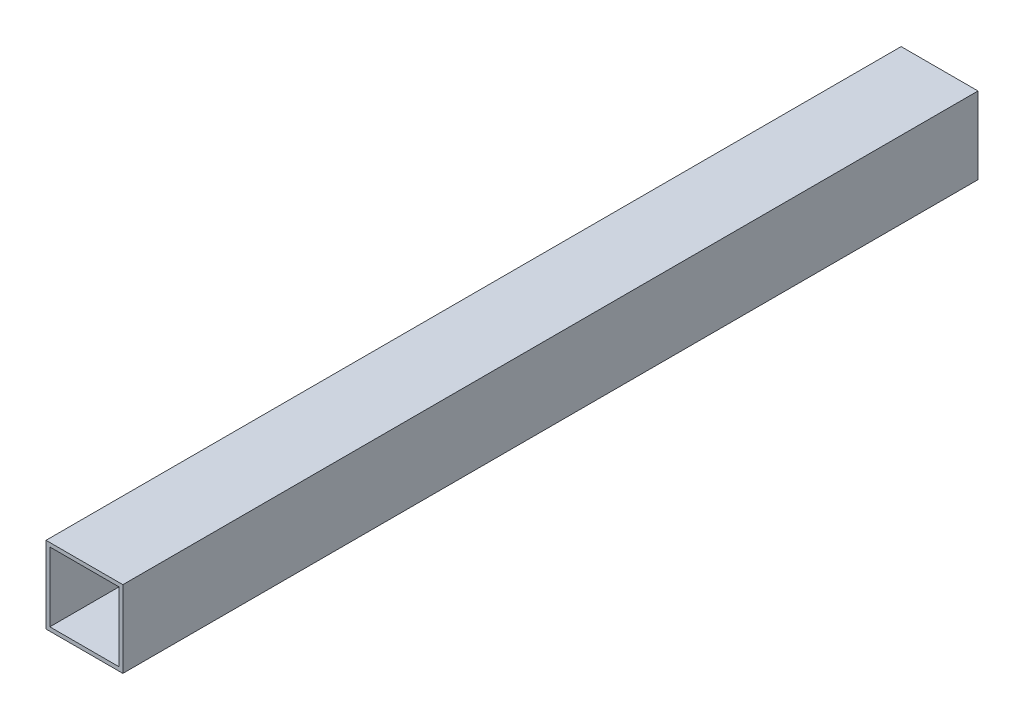
ISO-10303-21;
HEADER;
FILE_DESCRIPTION(('STEP AP214'),'2;1');
FILE_NAME('part.step','',(''),(''),'','','');
FILE_SCHEMA(('AUTOMOTIVE_DESIGN { 1 0 10303 214 1 1 1 1 }'));
ENDSEC;
DATA;
#1=APPLICATION_CONTEXT('core data for automotive mechanical design processes');
#2=APPLICATION_PROTOCOL_DEFINITION('international standard','automotive_design',2000,#1);
#3=PRODUCT_CONTEXT('',#1,'mechanical');
#4=PRODUCT('Part','Part','',(#3));
#5=PRODUCT_RELATED_PRODUCT_CATEGORY('part','',(#4));
#6=PRODUCT_DEFINITION_FORMATION('','',#4);
#7=PRODUCT_DEFINITION_CONTEXT('part definition',#1,'design');
#8=PRODUCT_DEFINITION('design','',#6,#7);
#9=PRODUCT_DEFINITION_SHAPE('','',#8);
#10=(LENGTH_UNIT() NAMED_UNIT(*) SI_UNIT(.MILLI.,.METRE.));
#11=(NAMED_UNIT(*) PLANE_ANGLE_UNIT() SI_UNIT($,.RADIAN.));
#12=(NAMED_UNIT(*) SI_UNIT($,.STERADIAN.) SOLID_ANGLE_UNIT());
#13=UNCERTAINTY_MEASURE_WITH_UNIT(LENGTH_MEASURE(1.E-05),#10,'distance_accuracy_value','');
#14=(GEOMETRIC_REPRESENTATION_CONTEXT(3) GLOBAL_UNCERTAINTY_ASSIGNED_CONTEXT((#13)) GLOBAL_UNIT_ASSIGNED_CONTEXT((#10,
#11,#12)) REPRESENTATION_CONTEXT('',''));
#15=CARTESIAN_POINT('',(0.,0.,0.));
#16=DIRECTION('',(0.,0.,1.));
#17=DIRECTION('',(1.,0.,0.));
#18=AXIS2_PLACEMENT_3D('',#15,#16,#17);
#19=CARTESIAN_POINT('',(-20.,-20.,445.));
#20=DIRECTION('',(0.,0.,1.));
#21=DIRECTION('',(1.,0.,0.));
#22=AXIS2_PLACEMENT_3D('',#19,#20,#21);
#23=PLANE('',#22);
#24=DIRECTION('',(0.,-1.,0.));
#25=VECTOR('',#24,1.);
#26=CARTESIAN_POINT('',(-20.,-20.,445.));
#27=LINE('',#26,#25);
#28=CARTESIAN_POINT('',(-20.,20.,445.));
#29=VERTEX_POINT('',#28);
#30=CARTESIAN_POINT('',(-20.,-20.,445.));
#31=VERTEX_POINT('',#30);
#32=EDGE_CURVE('E156',#29,#31,#27,.T.);
#33=ORIENTED_EDGE('',*,*,#32,.T.);
#34=DIRECTION('',(1.,0.,0.));
#35=VECTOR('',#34,1.);
#36=CARTESIAN_POINT('',(20.,-20.,445.));
#37=LINE('',#36,#35);
#38=CARTESIAN_POINT('',(20.,-20.,445.));
#39=VERTEX_POINT('',#38);
#40=EDGE_CURVE('E159',#31,#39,#37,.T.);
#41=ORIENTED_EDGE('',*,*,#40,.T.);
#42=DIRECTION('',(0.,1.,0.));
#43=VECTOR('',#42,1.);
#44=CARTESIAN_POINT('',(20.,-20.,445.));
#45=LINE('',#44,#43);
#46=CARTESIAN_POINT('',(20.,20.,445.));
#47=VERTEX_POINT('',#46);
#48=EDGE_CURVE('E162',#39,#47,#45,.T.);
#49=ORIENTED_EDGE('',*,*,#48,.T.);
#50=DIRECTION('',(-1.,0.,0.));
#51=VECTOR('',#50,1.);
#52=CARTESIAN_POINT('',(20.,20.,445.));
#53=LINE('',#52,#51);
#54=EDGE_CURVE('E164',#47,#29,#53,.T.);
#55=ORIENTED_EDGE('',*,*,#54,.T.);
#56=EDGE_LOOP('',(#33,#41,#49,#55));
#57=FACE_BOUND('',#56,.T.);
#58=DIRECTION('',(1.,0.,0.));
#59=VECTOR('',#58,1.);
#60=CARTESIAN_POINT('',(20.,-18.,445.));
#61=LINE('',#60,#59);
#62=CARTESIAN_POINT('',(-18.,-18.,445.));
#63=VERTEX_POINT('',#62);
#64=CARTESIAN_POINT('',(18.,-18.,445.));
#65=VERTEX_POINT('',#64);
#66=EDGE_CURVE('E128',#63,#65,#61,.T.);
#67=ORIENTED_EDGE('',*,*,#66,.F.);
#68=DIRECTION('',(0.,-1.,0.));
#69=VECTOR('',#68,1.);
#70=CARTESIAN_POINT('',(-18.,-20.,445.));
#71=LINE('',#70,#69);
#72=CARTESIAN_POINT('',(-18.,18.,445.));
#73=VERTEX_POINT('',#72);
#74=EDGE_CURVE('E120',#73,#63,#71,.T.);
#75=ORIENTED_EDGE('',*,*,#74,.F.);
#76=DIRECTION('',(-1.,0.,0.));
#77=VECTOR('',#76,1.);
#78=CARTESIAN_POINT('',(20.,18.,445.));
#79=LINE('',#78,#77);
#80=CARTESIAN_POINT('',(18.,18.,445.));
#81=VERTEX_POINT('',#80);
#82=EDGE_CURVE('E142',#81,#73,#79,.T.);
#83=ORIENTED_EDGE('',*,*,#82,.F.);
#84=DIRECTION('',(0.,1.,0.));
#85=VECTOR('',#84,1.);
#86=CARTESIAN_POINT('',(18.,-20.,445.));
#87=LINE('',#86,#85);
#88=EDGE_CURVE('E140',#65,#81,#87,.T.);
#89=ORIENTED_EDGE('',*,*,#88,.F.);
#90=EDGE_LOOP('',(#67,#75,#83,#89));
#91=FACE_BOUND('',#90,.T.);
#92=ADVANCED_FACE('F55',(#57,#91),#23,.T.);
#93=CARTESIAN_POINT('',(-20.,-20.,0.));
#94=DIRECTION('',(0.,0.,1.));
#95=DIRECTION('',(1.,0.,0.));
#96=AXIS2_PLACEMENT_3D('',#93,#94,#95);
#97=PLANE('',#96);
#98=DIRECTION('',(0.,-1.,0.));
#99=VECTOR('',#98,1.);
#100=CARTESIAN_POINT('',(-20.,-20.,0.));
#101=LINE('',#100,#99);
#102=CARTESIAN_POINT('',(-20.,20.,0.));
#103=VERTEX_POINT('',#102);
#104=CARTESIAN_POINT('',(-20.,-20.,0.));
#105=VERTEX_POINT('',#104);
#106=EDGE_CURVE('E136',#103,#105,#101,.T.);
#107=ORIENTED_EDGE('',*,*,#106,.F.);
#108=DIRECTION('',(-1.,0.,0.));
#109=VECTOR('',#108,1.);
#110=CARTESIAN_POINT('',(20.,20.,0.));
#111=LINE('',#110,#109);
#112=CARTESIAN_POINT('',(20.,20.,0.));
#113=VERTEX_POINT('',#112);
#114=EDGE_CURVE('E160',#113,#103,#111,.T.);
#115=ORIENTED_EDGE('',*,*,#114,.F.);
#116=DIRECTION('',(0.,1.,0.));
#117=VECTOR('',#116,1.);
#118=CARTESIAN_POINT('',(20.,-20.,0.));
#119=LINE('',#118,#117);
#120=CARTESIAN_POINT('',(20.,-20.,0.));
#121=VERTEX_POINT('',#120);
#122=EDGE_CURVE('E171',#121,#113,#119,.T.);
#123=ORIENTED_EDGE('',*,*,#122,.F.);
#124=DIRECTION('',(1.,0.,0.));
#125=VECTOR('',#124,1.);
#126=CARTESIAN_POINT('',(20.,-20.,0.));
#127=LINE('',#126,#125);
#128=EDGE_CURVE('E169',#105,#121,#127,.T.);
#129=ORIENTED_EDGE('',*,*,#128,.F.);
#130=EDGE_LOOP('',(#107,#115,#123,#129));
#131=FACE_BOUND('',#130,.T.);
#132=DIRECTION('',(0.,-1.,0.));
#133=VECTOR('',#132,1.);
#134=CARTESIAN_POINT('',(-18.,-20.,0.));
#135=LINE('',#134,#133);
#136=CARTESIAN_POINT('',(-18.,18.,0.));
#137=VERTEX_POINT('',#136);
#138=CARTESIAN_POINT('',(-18.,-18.,0.));
#139=VERTEX_POINT('',#138);
#140=EDGE_CURVE('E78',#137,#139,#135,.T.);
#141=ORIENTED_EDGE('',*,*,#140,.T.);
#142=DIRECTION('',(1.,0.,0.));
#143=VECTOR('',#142,1.);
#144=CARTESIAN_POINT('',(20.,-18.,0.));
#145=LINE('',#144,#143);
#146=CARTESIAN_POINT('',(18.,-18.,0.));
#147=VERTEX_POINT('',#146);
#148=EDGE_CURVE('E135',#139,#147,#145,.T.);
#149=ORIENTED_EDGE('',*,*,#148,.T.);
#150=DIRECTION('',(0.,1.,0.));
#151=VECTOR('',#150,1.);
#152=CARTESIAN_POINT('',(18.,-20.,0.));
#153=LINE('',#152,#151);
#154=CARTESIAN_POINT('',(18.,18.,0.));
#155=VERTEX_POINT('',#154);
#156=EDGE_CURVE('E148',#147,#155,#153,.T.);
#157=ORIENTED_EDGE('',*,*,#156,.T.);
#158=DIRECTION('',(-1.,0.,0.));
#159=VECTOR('',#158,1.);
#160=CARTESIAN_POINT('',(20.,18.,0.));
#161=LINE('',#160,#159);
#162=EDGE_CURVE('E129',#155,#137,#161,.T.);
#163=ORIENTED_EDGE('',*,*,#162,.T.);
#164=EDGE_LOOP('',(#141,#149,#157,#163));
#165=FACE_BOUND('',#164,.T.);
#166=ADVANCED_FACE('F189',(#131,#165),#97,.F.);
#167=CARTESIAN_POINT('',(-20.,-20.,445.));
#168=DIRECTION('',(1.,0.,0.));
#169=DIRECTION('',(0.,0.,-1.));
#170=AXIS2_PLACEMENT_3D('',#167,#168,#169);
#171=PLANE('',#170);
#172=ORIENTED_EDGE('',*,*,#106,.T.);
#173=DIRECTION('',(0.,0.,-1.));
#174=VECTOR('',#173,1.);
#175=CARTESIAN_POINT('',(-20.,-20.,445.));
#176=LINE('',#175,#174);
#177=EDGE_CURVE('E12',#31,#105,#176,.T.);
#178=ORIENTED_EDGE('',*,*,#177,.F.);
#179=ORIENTED_EDGE('',*,*,#32,.F.);
#180=DIRECTION('',(0.,0.,-1.));
#181=VECTOR('',#180,1.);
#182=CARTESIAN_POINT('',(-20.,20.,445.));
#183=LINE('',#182,#181);
#184=EDGE_CURVE('E166',#29,#103,#183,.T.);
#185=ORIENTED_EDGE('',*,*,#184,.T.);
#186=EDGE_LOOP('',(#172,#178,#179,#185));
#187=FACE_BOUND('',#186,.T.);
#188=ADVANCED_FACE('F57',(#187),#171,.F.);
#189=CARTESIAN_POINT('',(20.,-20.,445.));
#190=DIRECTION('',(0.,1.,0.));
#191=DIRECTION('',(-1.,0.,0.));
#192=AXIS2_PLACEMENT_3D('',#189,#190,#191);
#193=PLANE('',#192);
#194=ORIENTED_EDGE('',*,*,#128,.T.);
#195=DIRECTION('',(0.,0.,-1.));
#196=VECTOR('',#195,1.);
#197=CARTESIAN_POINT('',(20.,-20.,445.));
#198=LINE('',#197,#196);
#199=EDGE_CURVE('E63',#39,#121,#198,.T.);
#200=ORIENTED_EDGE('',*,*,#199,.F.);
#201=ORIENTED_EDGE('',*,*,#40,.F.);
#202=ORIENTED_EDGE('',*,*,#177,.T.);
#203=EDGE_LOOP('',(#194,#200,#201,#202));
#204=FACE_BOUND('',#203,.T.);
#205=ADVANCED_FACE('F199',(#204),#193,.F.);
#206=CARTESIAN_POINT('',(20.,-20.,445.));
#207=DIRECTION('',(-1.,0.,0.));
#208=DIRECTION('',(0.,0.,1.));
#209=AXIS2_PLACEMENT_3D('',#206,#207,#208);
#210=PLANE('',#209);
#211=ORIENTED_EDGE('',*,*,#122,.T.);
#212=DIRECTION('',(0.,0.,-1.));
#213=VECTOR('',#212,1.);
#214=CARTESIAN_POINT('',(20.,20.,445.));
#215=LINE('',#214,#213);
#216=EDGE_CURVE('E176',#47,#113,#215,.T.);
#217=ORIENTED_EDGE('',*,*,#216,.F.);
#218=ORIENTED_EDGE('',*,*,#48,.F.);
#219=ORIENTED_EDGE('',*,*,#199,.T.);
#220=EDGE_LOOP('',(#211,#217,#218,#219));
#221=FACE_BOUND('',#220,.T.);
#222=ADVANCED_FACE('F183',(#221),#210,.F.);
#223=CARTESIAN_POINT('',(20.,20.,445.));
#224=DIRECTION('',(0.,-1.,0.));
#225=DIRECTION('',(1.,0.,0.));
#226=AXIS2_PLACEMENT_3D('',#223,#224,#225);
#227=PLANE('',#226);
#228=ORIENTED_EDGE('',*,*,#114,.T.);
#229=ORIENTED_EDGE('',*,*,#184,.F.);
#230=ORIENTED_EDGE('',*,*,#54,.F.);
#231=ORIENTED_EDGE('',*,*,#216,.T.);
#232=EDGE_LOOP('',(#228,#229,#230,#231));
#233=FACE_BOUND('',#232,.T.);
#234=ADVANCED_FACE('F193',(#233),#227,.F.);
#235=CARTESIAN_POINT('',(-18.,-20.,445.));
#236=DIRECTION('',(1.,0.,0.));
#237=DIRECTION('',(0.,0.,-1.));
#238=AXIS2_PLACEMENT_3D('',#235,#236,#237);
#239=PLANE('',#238);
#240=ORIENTED_EDGE('',*,*,#140,.F.);
#241=DIRECTION('',(0.,0.,-1.));
#242=VECTOR('',#241,1.);
#243=CARTESIAN_POINT('',(-18.,18.,445.));
#244=LINE('',#243,#242);
#245=EDGE_CURVE('E124',#73,#137,#244,.T.);
#246=ORIENTED_EDGE('',*,*,#245,.F.);
#247=ORIENTED_EDGE('',*,*,#74,.T.);
#248=DIRECTION('',(0.,0.,-1.));
#249=VECTOR('',#248,1.);
#250=CARTESIAN_POINT('',(-18.,-18.,445.));
#251=LINE('',#250,#249);
#252=EDGE_CURVE('E123',#63,#139,#251,.T.);
#253=ORIENTED_EDGE('',*,*,#252,.T.);
#254=EDGE_LOOP('',(#240,#246,#247,#253));
#255=FACE_BOUND('',#254,.T.);
#256=ADVANCED_FACE('F122',(#255),#239,.T.);
#257=CARTESIAN_POINT('',(20.,-18.,445.));
#258=DIRECTION('',(0.,1.,0.));
#259=DIRECTION('',(-1.,0.,0.));
#260=AXIS2_PLACEMENT_3D('',#257,#258,#259);
#261=PLANE('',#260);
#262=ORIENTED_EDGE('',*,*,#148,.F.);
#263=ORIENTED_EDGE('',*,*,#252,.F.);
#264=ORIENTED_EDGE('',*,*,#66,.T.);
#265=DIRECTION('',(0.,0.,-1.));
#266=VECTOR('',#265,1.);
#267=CARTESIAN_POINT('',(18.,-18.,445.));
#268=LINE('',#267,#266);
#269=EDGE_CURVE('E137',#65,#147,#268,.T.);
#270=ORIENTED_EDGE('',*,*,#269,.T.);
#271=EDGE_LOOP('',(#262,#263,#264,#270));
#272=FACE_BOUND('',#271,.T.);
#273=ADVANCED_FACE('F132',(#272),#261,.T.);
#274=CARTESIAN_POINT('',(18.,-20.,445.));
#275=DIRECTION('',(-1.,0.,0.));
#276=DIRECTION('',(0.,0.,1.));
#277=AXIS2_PLACEMENT_3D('',#274,#275,#276);
#278=PLANE('',#277);
#279=ORIENTED_EDGE('',*,*,#156,.F.);
#280=ORIENTED_EDGE('',*,*,#269,.F.);
#281=ORIENTED_EDGE('',*,*,#88,.T.);
#282=DIRECTION('',(0.,0.,-1.));
#283=VECTOR('',#282,1.);
#284=CARTESIAN_POINT('',(18.,18.,445.));
#285=LINE('',#284,#283);
#286=EDGE_CURVE('E70',#81,#155,#285,.T.);
#287=ORIENTED_EDGE('',*,*,#286,.T.);
#288=EDGE_LOOP('',(#279,#280,#281,#287));
#289=FACE_BOUND('',#288,.T.);
#290=ADVANCED_FACE('F222',(#289),#278,.T.);
#291=CARTESIAN_POINT('',(20.,18.,445.));
#292=DIRECTION('',(0.,-1.,0.));
#293=DIRECTION('',(1.,0.,0.));
#294=AXIS2_PLACEMENT_3D('',#291,#292,#293);
#295=PLANE('',#294);
#296=ORIENTED_EDGE('',*,*,#162,.F.);
#297=ORIENTED_EDGE('',*,*,#286,.F.);
#298=ORIENTED_EDGE('',*,*,#82,.T.);
#299=ORIENTED_EDGE('',*,*,#245,.T.);
#300=EDGE_LOOP('',(#296,#297,#298,#299));
#301=FACE_BOUND('',#300,.T.);
#302=ADVANCED_FACE('F226',(#301),#295,.T.);
#303=CLOSED_SHELL('',(#92,#166,#188,#205,#222,#234,#256,#273,#290,#302));
#304=MANIFOLD_SOLID_BREP('B2',#303);
#305=ADVANCED_BREP_SHAPE_REPRESENTATION('',(#18,#304),#14);
#306=SHAPE_DEFINITION_REPRESENTATION(#9,#305);
ENDSEC;
END-ISO-10303-21;
